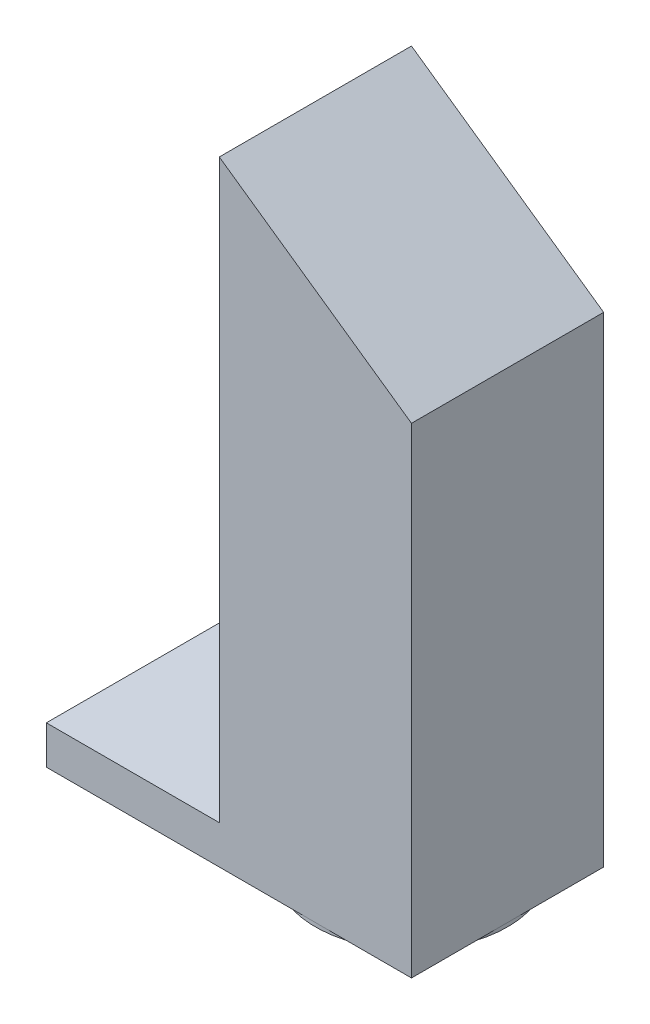
ISO-10303-21;
HEADER;
FILE_DESCRIPTION(('STEP AP214'),'2;1');
FILE_NAME('part.step','',(''),(''),'','','');
FILE_SCHEMA(('AUTOMOTIVE_DESIGN { 1 0 10303 214 1 1 1 1 }'));
ENDSEC;
DATA;
#1=APPLICATION_CONTEXT('core data for automotive mechanical design processes');
#2=APPLICATION_PROTOCOL_DEFINITION('international standard','automotive_design',2000,#1);
#3=PRODUCT_CONTEXT('',#1,'mechanical');
#4=PRODUCT('Part','Part','',(#3));
#5=PRODUCT_RELATED_PRODUCT_CATEGORY('part','',(#4));
#6=PRODUCT_DEFINITION_FORMATION('','',#4);
#7=PRODUCT_DEFINITION_CONTEXT('part definition',#1,'design');
#8=PRODUCT_DEFINITION('design','',#6,#7);
#9=PRODUCT_DEFINITION_SHAPE('','',#8);
#10=(LENGTH_UNIT() NAMED_UNIT(*) SI_UNIT(.MILLI.,.METRE.));
#11=(NAMED_UNIT(*) PLANE_ANGLE_UNIT() SI_UNIT($,.RADIAN.));
#12=(NAMED_UNIT(*) SI_UNIT($,.STERADIAN.) SOLID_ANGLE_UNIT());
#13=UNCERTAINTY_MEASURE_WITH_UNIT(LENGTH_MEASURE(1.E-05),#10,'distance_accuracy_value','');
#14=(GEOMETRIC_REPRESENTATION_CONTEXT(3) GLOBAL_UNCERTAINTY_ASSIGNED_CONTEXT((#13)) GLOBAL_UNIT_ASSIGNED_CONTEXT((#10,
#11,#12)) REPRESENTATION_CONTEXT('',''));
#15=CARTESIAN_POINT('',(0.,0.,0.));
#16=DIRECTION('',(0.,0.,1.));
#17=DIRECTION('',(1.,0.,0.));
#18=AXIS2_PLACEMENT_3D('',#15,#16,#17);
#19=CARTESIAN_POINT('',(0.,-11.,0.));
#20=DIRECTION('',(0.,1.,0.));
#21=DIRECTION('',(0.,0.,1.));
#22=AXIS2_PLACEMENT_3D('',#19,#20,#21);
#23=PLANE('',#22);
#24=CARTESIAN_POINT('',(2.5,-11.,2.5));
#25=DIRECTION('',(0.,-1.,0.));
#26=DIRECTION('',(0.,0.,-1.));
#27=AXIS2_PLACEMENT_3D('',#24,#25,#26);
#28=CIRCLE('',#27,2.5);
#29=CARTESIAN_POINT('',(2.5,-11.,0.));
#30=VERTEX_POINT('',#29);
#31=CARTESIAN_POINT('',(5.,-11.,2.5));
#32=VERTEX_POINT('',#31);
#33=EDGE_CURVE('E56',#30,#32,#28,.T.);
#34=ORIENTED_EDGE('',*,*,#33,.F.);
#35=DIRECTION('',(1.,0.,0.));
#36=VECTOR('',#35,1.);
#37=CARTESIAN_POINT('',(5.,-11.,0.));
#38=LINE('',#37,#36);
#39=CARTESIAN_POINT('',(5.,-11.,0.));
#40=VERTEX_POINT('',#39);
#41=EDGE_CURVE('E115',#30,#40,#38,.T.);
#42=ORIENTED_EDGE('',*,*,#41,.T.);
#43=DIRECTION('',(0.,0.,1.));
#44=VECTOR('',#43,1.);
#45=CARTESIAN_POINT('',(5.,-11.,5.));
#46=LINE('',#45,#44);
#47=EDGE_CURVE('E126',#40,#32,#46,.T.);
#48=ORIENTED_EDGE('',*,*,#47,.T.);
#49=EDGE_LOOP('',(#34,#42,#48));
#50=FACE_BOUND('',#49,.T.);
#51=ADVANCED_FACE('F45',(#50),#23,.F.);
#52=CARTESIAN_POINT('',(2.5,-11.,5.));
#53=VERTEX_POINT('',#52);
#54=EDGE_CURVE('E13',#32,#53,#28,.T.);
#55=ORIENTED_EDGE('',*,*,#54,.F.);
#56=CARTESIAN_POINT('',(5.,-11.,5.));
#57=VERTEX_POINT('',#56);
#58=EDGE_CURVE('E136',#32,#57,#46,.T.);
#59=ORIENTED_EDGE('',*,*,#58,.T.);
#60=DIRECTION('',(-1.,0.,0.));
#61=VECTOR('',#60,1.);
#62=CARTESIAN_POINT('',(5.,-11.,5.));
#63=LINE('',#62,#61);
#64=EDGE_CURVE('E137',#57,#53,#63,.T.);
#65=ORIENTED_EDGE('',*,*,#64,.T.);
#66=EDGE_LOOP('',(#55,#59,#65));
#67=FACE_BOUND('',#66,.T.);
#68=ADVANCED_FACE('F195',(#67),#23,.F.);
#69=CARTESIAN_POINT('',(5.,1.49896230895141,5.));
#70=DIRECTION('',(-1.,0.,0.));
#71=DIRECTION('',(0.,0.,1.));
#72=AXIS2_PLACEMENT_3D('',#69,#70,#71);
#73=PLANE('',#72);
#74=DIRECTION('',(0.,1.,0.));
#75=VECTOR('',#74,1.);
#76=CARTESIAN_POINT('',(5.,1.49896230895141,0.));
#77=LINE('',#76,#75);
#78=CARTESIAN_POINT('',(5.,1.49896230895141,0.));
#79=VERTEX_POINT('',#78);
#80=EDGE_CURVE('E121',#40,#79,#77,.T.);
#81=ORIENTED_EDGE('',*,*,#80,.T.);
#82=DIRECTION('',(0.,0.,-1.));
#83=VECTOR('',#82,1.);
#84=CARTESIAN_POINT('',(5.,1.49896230895141,5.));
#85=LINE('',#84,#83);
#86=CARTESIAN_POINT('',(5.,1.49896230895141,5.));
#87=VERTEX_POINT('',#86);
#88=EDGE_CURVE('E131',#87,#79,#85,.T.);
#89=ORIENTED_EDGE('',*,*,#88,.F.);
#90=DIRECTION('',(0.,1.,0.));
#91=VECTOR('',#90,1.);
#92=CARTESIAN_POINT('',(5.,1.49896230895141,5.));
#93=LINE('',#92,#91);
#94=EDGE_CURVE('E153',#57,#87,#93,.T.);
#95=ORIENTED_EDGE('',*,*,#94,.F.);
#96=ORIENTED_EDGE('',*,*,#58,.F.);
#97=ORIENTED_EDGE('',*,*,#47,.F.);
#98=EDGE_LOOP('',(#81,#89,#95,#96,#97));
#99=FACE_BOUND('',#98,.T.);
#100=ADVANCED_FACE('F47',(#99),#73,.F.);
#101=CARTESIAN_POINT('',(0.,5.,5.));
#102=DIRECTION('',(-0.57357643635105,-0.819152044288989,0.));
#103=DIRECTION('',(0.819152044288989,-0.57357643635105,0.));
#104=AXIS2_PLACEMENT_3D('',#101,#102,#103);
#105=PLANE('',#104);
#106=DIRECTION('',(-0.819152044288989,0.57357643635105,0.));
#107=VECTOR('',#106,1.);
#108=CARTESIAN_POINT('',(0.,5.,0.));
#109=LINE('',#108,#107);
#110=CARTESIAN_POINT('',(0.,5.,0.));
#111=VERTEX_POINT('',#110);
#112=EDGE_CURVE('E161',#79,#111,#109,.T.);
#113=ORIENTED_EDGE('',*,*,#112,.T.);
#114=DIRECTION('',(0.,0.,-1.));
#115=VECTOR('',#114,1.);
#116=CARTESIAN_POINT('',(0.,5.,5.));
#117=LINE('',#116,#115);
#118=CARTESIAN_POINT('',(0.,5.,5.));
#119=VERTEX_POINT('',#118);
#120=EDGE_CURVE('E159',#119,#111,#117,.T.);
#121=ORIENTED_EDGE('',*,*,#120,.F.);
#122=DIRECTION('',(-0.819152044288989,0.57357643635105,0.));
#123=VECTOR('',#122,1.);
#124=CARTESIAN_POINT('',(0.,5.,5.));
#125=LINE('',#124,#123);
#126=EDGE_CURVE('E156',#87,#119,#125,.T.);
#127=ORIENTED_EDGE('',*,*,#126,.F.);
#128=ORIENTED_EDGE('',*,*,#88,.T.);
#129=EDGE_LOOP('',(#113,#121,#127,#128));
#130=FACE_BOUND('',#129,.T.);
#131=ADVANCED_FACE('F169',(#130),#105,.F.);
#132=CARTESIAN_POINT('',(0.,0.,5.));
#133=DIRECTION('',(1.,0.,0.));
#134=DIRECTION('',(0.,0.,-1.));
#135=AXIS2_PLACEMENT_3D('',#132,#133,#134);
#136=PLANE('',#135);
#137=DIRECTION('',(0.,-1.,0.));
#138=VECTOR('',#137,1.);
#139=CARTESIAN_POINT('',(0.,0.,0.));
#140=LINE('',#139,#138);
#141=CARTESIAN_POINT('',(0.,-10.,0.));
#142=VERTEX_POINT('',#141);
#143=EDGE_CURVE('E154',#111,#142,#140,.T.);
#144=ORIENTED_EDGE('',*,*,#143,.T.);
#145=DIRECTION('',(0.,0.,-1.));
#146=VECTOR('',#145,1.);
#147=CARTESIAN_POINT('',(0.,-10.,5.));
#148=LINE('',#147,#146);
#149=CARTESIAN_POINT('',(0.,-10.,5.));
#150=VERTEX_POINT('',#149);
#151=EDGE_CURVE('E49',#150,#142,#148,.T.);
#152=ORIENTED_EDGE('',*,*,#151,.F.);
#153=DIRECTION('',(0.,-1.,0.));
#154=VECTOR('',#153,1.);
#155=CARTESIAN_POINT('',(0.,0.,5.));
#156=LINE('',#155,#154);
#157=EDGE_CURVE('E151',#119,#150,#156,.T.);
#158=ORIENTED_EDGE('',*,*,#157,.F.);
#159=ORIENTED_EDGE('',*,*,#120,.T.);
#160=EDGE_LOOP('',(#144,#152,#158,#159));
#161=FACE_BOUND('',#160,.T.);
#162=ADVANCED_FACE('F177',(#161),#136,.F.);
#163=CARTESIAN_POINT('',(0.,0.,5.));
#164=DIRECTION('',(0.,0.,1.));
#165=DIRECTION('',(1.,0.,0.));
#166=AXIS2_PLACEMENT_3D('',#163,#164,#165);
#167=PLANE('',#166);
#168=ORIENTED_EDGE('',*,*,#157,.T.);
#169=DIRECTION('',(-1.,0.,0.));
#170=VECTOR('',#169,1.);
#171=CARTESIAN_POINT('',(5.,-10.,5.));
#172=LINE('',#171,#170);
#173=CARTESIAN_POINT('',(-4.5,-10.,5.));
#174=VERTEX_POINT('',#173);
#175=EDGE_CURVE('E140',#150,#174,#172,.T.);
#176=ORIENTED_EDGE('',*,*,#175,.T.);
#177=DIRECTION('',(0.,1.,0.));
#178=VECTOR('',#177,1.);
#179=CARTESIAN_POINT('',(-4.5,-11.,5.));
#180=LINE('',#179,#178);
#181=CARTESIAN_POINT('',(-4.5,-11.,5.));
#182=VERTEX_POINT('',#181);
#183=EDGE_CURVE('E148',#182,#174,#180,.T.);
#184=ORIENTED_EDGE('',*,*,#183,.F.);
#185=EDGE_CURVE('E135',#53,#182,#63,.T.);
#186=ORIENTED_EDGE('',*,*,#185,.F.);
#187=ORIENTED_EDGE('',*,*,#64,.F.);
#188=ORIENTED_EDGE('',*,*,#94,.T.);
#189=ORIENTED_EDGE('',*,*,#126,.T.);
#190=EDGE_LOOP('',(#168,#176,#184,#186,#187,#188,#189));
#191=FACE_BOUND('',#190,.T.);
#192=ADVANCED_FACE('F184',(#191),#167,.T.);
#193=CARTESIAN_POINT('',(0.,0.,0.));
#194=DIRECTION('',(0.,0.,1.));
#195=DIRECTION('',(1.,0.,0.));
#196=AXIS2_PLACEMENT_3D('',#193,#194,#195);
#197=PLANE('',#196);
#198=ORIENTED_EDGE('',*,*,#80,.F.);
#199=ORIENTED_EDGE('',*,*,#41,.F.);
#200=CARTESIAN_POINT('',(-4.5,-11.,0.));
#201=VERTEX_POINT('',#200);
#202=EDGE_CURVE('E106',#201,#30,#38,.T.);
#203=ORIENTED_EDGE('',*,*,#202,.F.);
#204=DIRECTION('',(0.,1.,0.));
#205=VECTOR('',#204,1.);
#206=CARTESIAN_POINT('',(-4.5,-11.,0.));
#207=LINE('',#206,#205);
#208=CARTESIAN_POINT('',(-4.5,-10.,0.));
#209=VERTEX_POINT('',#208);
#210=EDGE_CURVE('E114',#201,#209,#207,.T.);
#211=ORIENTED_EDGE('',*,*,#210,.T.);
#212=DIRECTION('',(1.,0.,0.));
#213=VECTOR('',#212,1.);
#214=CARTESIAN_POINT('',(5.,-10.,0.));
#215=LINE('',#214,#213);
#216=EDGE_CURVE('E144',#209,#142,#215,.T.);
#217=ORIENTED_EDGE('',*,*,#216,.T.);
#218=ORIENTED_EDGE('',*,*,#143,.F.);
#219=ORIENTED_EDGE('',*,*,#112,.F.);
#220=EDGE_LOOP('',(#198,#199,#203,#211,#217,#218,#219));
#221=FACE_BOUND('',#220,.T.);
#222=ADVANCED_FACE('F119',(#221),#197,.F.);
#223=CARTESIAN_POINT('',(-4.5,-11.,5.));
#224=DIRECTION('',(1.,0.,0.));
#225=DIRECTION('',(0.,0.,-1.));
#226=AXIS2_PLACEMENT_3D('',#223,#224,#225);
#227=PLANE('',#226);
#228=DIRECTION('',(0.,0.,-1.));
#229=VECTOR('',#228,1.);
#230=CARTESIAN_POINT('',(-4.5,-10.,5.));
#231=LINE('',#230,#229);
#232=EDGE_CURVE('E142',#174,#209,#231,.T.);
#233=ORIENTED_EDGE('',*,*,#232,.T.);
#234=ORIENTED_EDGE('',*,*,#210,.F.);
#235=DIRECTION('',(0.,0.,-1.));
#236=VECTOR('',#235,1.);
#237=CARTESIAN_POINT('',(-4.5,-11.,5.));
#238=LINE('',#237,#236);
#239=EDGE_CURVE('E110',#182,#201,#238,.T.);
#240=ORIENTED_EDGE('',*,*,#239,.F.);
#241=ORIENTED_EDGE('',*,*,#183,.T.);
#242=EDGE_LOOP('',(#233,#234,#240,#241));
#243=FACE_BOUND('',#242,.T.);
#244=ADVANCED_FACE('F186',(#243),#227,.F.);
#245=EDGE_CURVE('E54',#53,#30,#28,.T.);
#246=ORIENTED_EDGE('',*,*,#245,.F.);
#247=ORIENTED_EDGE('',*,*,#185,.T.);
#248=ORIENTED_EDGE('',*,*,#239,.T.);
#249=ORIENTED_EDGE('',*,*,#202,.T.);
#250=EDGE_LOOP('',(#246,#247,#248,#249));
#251=FACE_BOUND('',#250,.T.);
#252=ADVANCED_FACE('F108',(#251),#23,.F.);
#253=CARTESIAN_POINT('',(0.,-10.,0.));
#254=DIRECTION('',(0.,1.,0.));
#255=DIRECTION('',(0.,0.,1.));
#256=AXIS2_PLACEMENT_3D('',#253,#254,#255);
#257=PLANE('',#256);
#258=ORIENTED_EDGE('',*,*,#175,.F.);
#259=ORIENTED_EDGE('',*,*,#151,.T.);
#260=ORIENTED_EDGE('',*,*,#216,.F.);
#261=ORIENTED_EDGE('',*,*,#232,.F.);
#262=EDGE_LOOP('',(#258,#259,#260,#261));
#263=FACE_BOUND('',#262,.T.);
#264=ADVANCED_FACE('F180',(#263),#257,.T.);
#265=CARTESIAN_POINT('',(2.5,-11.1,2.5));
#266=DIRECTION('',(0.,1.,0.));
#267=DIRECTION('',(0.,0.,1.));
#268=AXIS2_PLACEMENT_3D('',#265,#266,#267);
#269=CYLINDRICAL_SURFACE('',#268,2.5);
#270=CARTESIAN_POINT('',(2.5,-11.1,2.5));
#271=DIRECTION('',(0.,-1.,0.));
#272=DIRECTION('',(0.,0.,-1.));
#273=AXIS2_PLACEMENT_3D('',#270,#271,#272);
#274=CIRCLE('',#273,2.5);
#275=CARTESIAN_POINT('',(2.5,-11.1,0.));
#276=VERTEX_POINT('',#275);
#277=EDGE_CURVE('E128',#276,#276,#274,.T.);
#278=ORIENTED_EDGE('',*,*,#277,.F.);
#279=EDGE_LOOP('',(#278));
#280=FACE_BOUND('',#279,.T.);
#281=ORIENTED_EDGE('',*,*,#33,.T.);
#282=ORIENTED_EDGE('',*,*,#54,.T.);
#283=ORIENTED_EDGE('',*,*,#245,.T.);
#284=EDGE_LOOP('',(#281,#282,#283));
#285=FACE_BOUND('',#284,.T.);
#286=ADVANCED_FACE('F129',(#280,#285),#269,.T.);
#287=CARTESIAN_POINT('',(2.5,-11.1,2.5));
#288=DIRECTION('',(0.,-1.,0.));
#289=DIRECTION('',(0.,0.,-1.));
#290=AXIS2_PLACEMENT_3D('',#287,#288,#289);
#291=PLANE('',#290);
#292=ORIENTED_EDGE('',*,*,#277,.T.);
#293=EDGE_LOOP('',(#292));
#294=FACE_BOUND('',#293,.T.);
#295=ADVANCED_FACE('F211',(#294),#291,.T.);
#296=CLOSED_SHELL('',(#51,#68,#100,#131,#162,#192,#222,#244,#252,#264,#286,#295));
#297=MANIFOLD_SOLID_BREP('B2',#296);
#298=ADVANCED_BREP_SHAPE_REPRESENTATION('',(#18,#297),#14);
#299=SHAPE_DEFINITION_REPRESENTATION(#9,#298);
ENDSEC;
END-ISO-10303-21;
